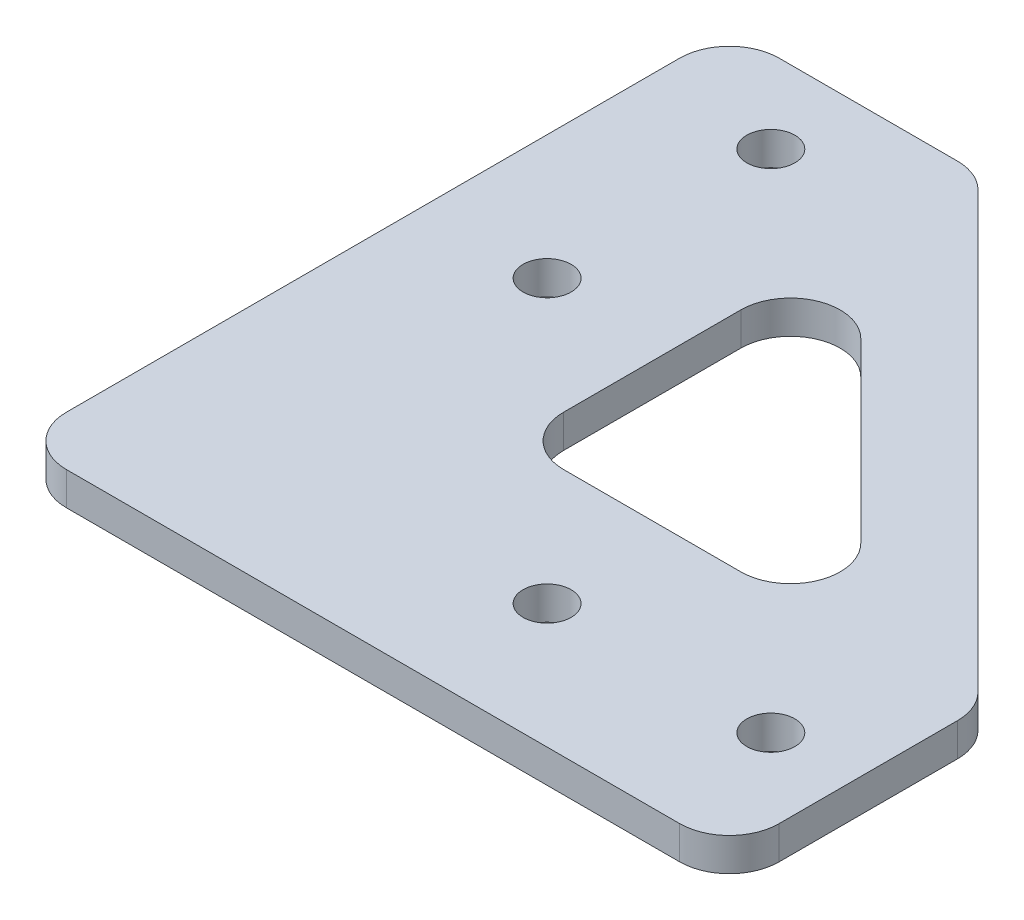
ISO-10303-21;
HEADER;
FILE_DESCRIPTION(('STEP AP214'),'2;1');
FILE_NAME('part.step','',(''),(''),'','','');
FILE_SCHEMA(('AUTOMOTIVE_DESIGN { 1 0 10303 214 1 1 1 1 }'));
ENDSEC;
DATA;
#1=APPLICATION_CONTEXT('core data for automotive mechanical design processes');
#2=APPLICATION_PROTOCOL_DEFINITION('international standard','automotive_design',2000,#1);
#3=PRODUCT_CONTEXT('',#1,'mechanical');
#4=PRODUCT('Part','Part','',(#3));
#5=PRODUCT_RELATED_PRODUCT_CATEGORY('part','',(#4));
#6=PRODUCT_DEFINITION_FORMATION('','',#4);
#7=PRODUCT_DEFINITION_CONTEXT('part definition',#1,'design');
#8=PRODUCT_DEFINITION('design','',#6,#7);
#9=PRODUCT_DEFINITION_SHAPE('','',#8);
#10=(LENGTH_UNIT() NAMED_UNIT(*) SI_UNIT(.MILLI.,.METRE.));
#11=(NAMED_UNIT(*) PLANE_ANGLE_UNIT() SI_UNIT($,.RADIAN.));
#12=(NAMED_UNIT(*) SI_UNIT($,.STERADIAN.) SOLID_ANGLE_UNIT());
#13=UNCERTAINTY_MEASURE_WITH_UNIT(LENGTH_MEASURE(1.E-05),#10,'distance_accuracy_value','');
#14=(GEOMETRIC_REPRESENTATION_CONTEXT(3) GLOBAL_UNCERTAINTY_ASSIGNED_CONTEXT((#13)) GLOBAL_UNIT_ASSIGNED_CONTEXT((#10,
#11,#12)) REPRESENTATION_CONTEXT('',''));
#15=CARTESIAN_POINT('',(0.,0.,0.));
#16=DIRECTION('',(0.,0.,1.));
#17=DIRECTION('',(1.,0.,0.));
#18=AXIS2_PLACEMENT_3D('',#15,#16,#17);
#19=CARTESIAN_POINT('',(0.,2.,0.));
#20=DIRECTION('',(0.,1.,0.));
#21=DIRECTION('',(0.,0.,1.));
#22=AXIS2_PLACEMENT_3D('',#19,#20,#21);
#23=PLANE('',#22);
#24=CARTESIAN_POINT('',(38.,2.,7.50000000000001));
#25=DIRECTION('',(0.,1.,0.));
#26=DIRECTION('',(0.,0.,1.));
#27=AXIS2_PLACEMENT_3D('',#24,#25,#26);
#28=CIRCLE('',#27,1.45);
#29=CARTESIAN_POINT('',(38.,2.,8.95000000000001));
#30=VERTEX_POINT('',#29);
#31=EDGE_CURVE('E386',#30,#30,#28,.T.);
#32=ORIENTED_EDGE('',*,*,#31,.F.);
#33=EDGE_LOOP('',(#32));
#34=FACE_BOUND('',#33,.T.);
#35=CARTESIAN_POINT('',(24.5,2.,7.50000000000001));
#36=DIRECTION('',(0.,1.,0.));
#37=DIRECTION('',(0.,0.,1.));
#38=AXIS2_PLACEMENT_3D('',#35,#36,#37);
#39=CIRCLE('',#38,1.45);
#40=CARTESIAN_POINT('',(24.5,2.,8.95));
#41=VERTEX_POINT('',#40);
#42=EDGE_CURVE('E269',#41,#41,#39,.T.);
#43=ORIENTED_EDGE('',*,*,#42,.F.);
#44=EDGE_LOOP('',(#43));
#45=FACE_BOUND('',#44,.T.);
#46=DIRECTION('',(-1.,0.,0.));
#47=VECTOR('',#46,1.);
#48=CARTESIAN_POINT('',(0.,2.,-28.));
#49=LINE('',#48,#47);
#50=CARTESIAN_POINT('',(13.7573593128807,2.,-28.));
#51=VERTEX_POINT('',#50);
#52=CARTESIAN_POINT('',(3.,2.,-28.));
#53=VERTEX_POINT('',#52);
#54=EDGE_CURVE('E178',#51,#53,#49,.T.);
#55=ORIENTED_EDGE('',*,*,#54,.T.);
#56=CARTESIAN_POINT('',(3.,2.,-25.));
#57=DIRECTION('',(0.,1.,0.));
#58=DIRECTION('',(0.,0.,1.));
#59=AXIS2_PLACEMENT_3D('',#56,#57,#58);
#60=CIRCLE('',#59,3.);
#61=CARTESIAN_POINT('',(0.,2.,-25.));
#62=VERTEX_POINT('',#61);
#63=EDGE_CURVE('E224',#53,#62,#60,.T.);
#64=ORIENTED_EDGE('',*,*,#63,.T.);
#65=DIRECTION('',(0.,0.,1.));
#66=VECTOR('',#65,1.);
#67=CARTESIAN_POINT('',(0.,2.,0.));
#68=LINE('',#67,#66);
#69=CARTESIAN_POINT('',(0.,2.,12.));
#70=VERTEX_POINT('',#69);
#71=EDGE_CURVE('E277',#62,#70,#68,.T.);
#72=ORIENTED_EDGE('',*,*,#71,.T.);
#73=CARTESIAN_POINT('',(3.,2.,12.));
#74=DIRECTION('',(0.,1.,0.));
#75=DIRECTION('',(0.,0.,1.));
#76=AXIS2_PLACEMENT_3D('',#73,#74,#75);
#77=CIRCLE('',#76,3.);
#78=CARTESIAN_POINT('',(3.,2.,15.));
#79=VERTEX_POINT('',#78);
#80=EDGE_CURVE('E217',#70,#79,#77,.T.);
#81=ORIENTED_EDGE('',*,*,#80,.T.);
#82=DIRECTION('',(1.,0.,0.));
#83=VECTOR('',#82,1.);
#84=CARTESIAN_POINT('',(0.,2.,15.));
#85=LINE('',#84,#83);
#86=CARTESIAN_POINT('',(40.,2.,15.));
#87=VERTEX_POINT('',#86);
#88=EDGE_CURVE('E280',#79,#87,#85,.T.);
#89=ORIENTED_EDGE('',*,*,#88,.T.);
#90=CARTESIAN_POINT('',(40.,2.,12.));
#91=DIRECTION('',(0.,1.,0.));
#92=DIRECTION('',(0.,0.,1.));
#93=AXIS2_PLACEMENT_3D('',#90,#91,#92);
#94=CIRCLE('',#93,3.);
#95=CARTESIAN_POINT('',(43.,2.,12.));
#96=VERTEX_POINT('',#95);
#97=EDGE_CURVE('E219',#87,#96,#94,.T.);
#98=ORIENTED_EDGE('',*,*,#97,.T.);
#99=DIRECTION('',(0.,0.,-1.));
#100=VECTOR('',#99,1.);
#101=CARTESIAN_POINT('',(43.,2.,0.));
#102=LINE('',#101,#100);
#103=CARTESIAN_POINT('',(43.,2.,1.24264068711928));
#104=VERTEX_POINT('',#103);
#105=EDGE_CURVE('E283',#96,#104,#102,.T.);
#106=ORIENTED_EDGE('',*,*,#105,.T.);
#107=CARTESIAN_POINT('',(40.,2.,1.24264068711928));
#108=DIRECTION('',(0.,1.,0.));
#109=DIRECTION('',(0.,0.,1.));
#110=AXIS2_PLACEMENT_3D('',#107,#108,#109);
#111=CIRCLE('',#110,3.);
#112=CARTESIAN_POINT('',(42.1213203435596,2.,-0.878679656440361));
#113=VERTEX_POINT('',#112);
#114=EDGE_CURVE('E63',#104,#113,#111,.T.);
#115=ORIENTED_EDGE('',*,*,#114,.T.);
#116=DIRECTION('',(-0.707106781186547,0.,-0.707106781186548));
#117=VECTOR('',#116,1.);
#118=CARTESIAN_POINT('',(15.,2.,-28.));
#119=LINE('',#118,#117);
#120=CARTESIAN_POINT('',(15.8786796564404,2.,-27.1213203435596));
#121=VERTEX_POINT('',#120);
#122=EDGE_CURVE('E183',#113,#121,#119,.T.);
#123=ORIENTED_EDGE('',*,*,#122,.T.);
#124=CARTESIAN_POINT('',(13.7573593128807,2.,-25.));
#125=DIRECTION('',(0.,1.,0.));
#126=DIRECTION('',(0.,0.,1.));
#127=AXIS2_PLACEMENT_3D('',#124,#125,#126);
#128=CIRCLE('',#127,3.);
#129=EDGE_CURVE('E222',#121,#51,#128,.T.);
#130=ORIENTED_EDGE('',*,*,#129,.T.);
#131=EDGE_LOOP('',(#55,#64,#72,#81,#89,#98,#106,#115,#123,#130));
#132=FACE_BOUND('',#131,.T.);
#133=DIRECTION('',(1.,0.,0.));
#134=VECTOR('',#133,1.);
#135=CARTESIAN_POINT('',(35.9289321881345,2.,0.));
#136=LINE('',#135,#134);
#137=CARTESIAN_POINT('',(18.,2.,0.));
#138=VERTEX_POINT('',#137);
#139=CARTESIAN_POINT('',(28.6862915010152,2.,0.));
#140=VERTEX_POINT('',#139);
#141=EDGE_CURVE('E264',#138,#140,#136,.T.);
#142=ORIENTED_EDGE('',*,*,#141,.F.);
#143=CARTESIAN_POINT('',(18.,2.,-3.));
#144=DIRECTION('',(0.,1.,0.));
#145=DIRECTION('',(0.,0.,1.));
#146=AXIS2_PLACEMENT_3D('',#143,#144,#145);
#147=CIRCLE('',#146,3.);
#148=CARTESIAN_POINT('',(15.,2.,-3.));
#149=VERTEX_POINT('',#148);
#150=EDGE_CURVE('E11',#138,#149,#147,.F.);
#151=ORIENTED_EDGE('',*,*,#150,.T.);
#152=DIRECTION('',(0.,0.,1.));
#153=VECTOR('',#152,1.);
#154=CARTESIAN_POINT('',(15.,2.,0.));
#155=LINE('',#154,#153);
#156=CARTESIAN_POINT('',(15.,2.,-13.6862915010152));
#157=VERTEX_POINT('',#156);
#158=EDGE_CURVE('E255',#157,#149,#155,.T.);
#159=ORIENTED_EDGE('',*,*,#158,.F.);
#160=CARTESIAN_POINT('',(18.,2.,-13.6862915010152));
#161=DIRECTION('',(0.,1.,0.));
#162=DIRECTION('',(0.,0.,1.));
#163=AXIS2_PLACEMENT_3D('',#160,#161,#162);
#164=CIRCLE('',#163,3.);
#165=CARTESIAN_POINT('',(20.1213203435596,2.,-15.8076118445749));
#166=VERTEX_POINT('',#165);
#167=EDGE_CURVE('E166',#157,#166,#164,.F.);
#168=ORIENTED_EDGE('',*,*,#167,.T.);
#169=DIRECTION('',(-0.707106781186547,0.,-0.707106781186548));
#170=VECTOR('',#169,1.);
#171=CARTESIAN_POINT('',(15.,2.,-20.9289321881345));
#172=LINE('',#171,#170);
#173=CARTESIAN_POINT('',(30.8076118445749,2.,-5.12132034355964));
#174=VERTEX_POINT('',#173);
#175=EDGE_CURVE('E252',#174,#166,#172,.T.);
#176=ORIENTED_EDGE('',*,*,#175,.F.);
#177=CARTESIAN_POINT('',(28.6862915010152,2.,-3.));
#178=DIRECTION('',(0.,1.,0.));
#179=DIRECTION('',(0.,0.,1.));
#180=AXIS2_PLACEMENT_3D('',#177,#178,#179);
#181=CIRCLE('',#180,3.);
#182=EDGE_CURVE('E242',#174,#140,#181,.F.);
#183=ORIENTED_EDGE('',*,*,#182,.T.);
#184=EDGE_LOOP('',(#142,#151,#159,#168,#176,#183));
#185=FACE_BOUND('',#184,.T.);
#186=CARTESIAN_POINT('',(7.5,2.,-9.5));
#187=DIRECTION('',(0.,1.,0.));
#188=DIRECTION('',(0.,0.,1.));
#189=AXIS2_PLACEMENT_3D('',#186,#187,#188);
#190=CIRCLE('',#189,1.45);
#191=CARTESIAN_POINT('',(7.5,2.,-8.05));
#192=VERTEX_POINT('',#191);
#193=EDGE_CURVE('E381',#192,#192,#190,.T.);
#194=ORIENTED_EDGE('',*,*,#193,.F.);
#195=EDGE_LOOP('',(#194));
#196=FACE_BOUND('',#195,.T.);
#197=CARTESIAN_POINT('',(7.5,2.,-23.));
#198=DIRECTION('',(0.,1.,0.));
#199=DIRECTION('',(0.,0.,1.));
#200=AXIS2_PLACEMENT_3D('',#197,#198,#199);
#201=CIRCLE('',#200,1.45);
#202=CARTESIAN_POINT('',(7.5,2.,-21.55));
#203=VERTEX_POINT('',#202);
#204=EDGE_CURVE('E392',#203,#203,#201,.T.);
#205=ORIENTED_EDGE('',*,*,#204,.F.);
#206=EDGE_LOOP('',(#205));
#207=FACE_BOUND('',#206,.T.);
#208=ADVANCED_FACE('F41',(#34,#45,#132,#185,#196,#207),#23,.T.);
#209=CARTESIAN_POINT('',(0.,0.,0.));
#210=DIRECTION('',(0.,1.,0.));
#211=DIRECTION('',(0.,0.,1.));
#212=AXIS2_PLACEMENT_3D('',#209,#210,#211);
#213=PLANE('',#212);
#214=DIRECTION('',(0.,0.,1.));
#215=VECTOR('',#214,1.);
#216=CARTESIAN_POINT('',(0.,0.,0.));
#217=LINE('',#216,#215);
#218=CARTESIAN_POINT('',(0.,0.,-25.));
#219=VERTEX_POINT('',#218);
#220=CARTESIAN_POINT('',(0.,0.,12.));
#221=VERTEX_POINT('',#220);
#222=EDGE_CURVE('E186',#219,#221,#217,.T.);
#223=ORIENTED_EDGE('',*,*,#222,.F.);
#224=CARTESIAN_POINT('',(3.,0.,-25.));
#225=DIRECTION('',(0.,1.,0.));
#226=DIRECTION('',(0.,0.,1.));
#227=AXIS2_PLACEMENT_3D('',#224,#225,#226);
#228=CIRCLE('',#227,3.);
#229=CARTESIAN_POINT('',(3.,0.,-28.));
#230=VERTEX_POINT('',#229);
#231=EDGE_CURVE('E210',#219,#230,#228,.F.);
#232=ORIENTED_EDGE('',*,*,#231,.T.);
#233=DIRECTION('',(-1.,0.,0.));
#234=VECTOR('',#233,1.);
#235=CARTESIAN_POINT('',(0.,0.,-28.));
#236=LINE('',#235,#234);
#237=CARTESIAN_POINT('',(13.7573593128807,0.,-28.));
#238=VERTEX_POINT('',#237);
#239=EDGE_CURVE('E292',#238,#230,#236,.T.);
#240=ORIENTED_EDGE('',*,*,#239,.F.);
#241=CARTESIAN_POINT('',(13.7573593128807,0.,-25.));
#242=DIRECTION('',(0.,1.,0.));
#243=DIRECTION('',(0.,0.,1.));
#244=AXIS2_PLACEMENT_3D('',#241,#242,#243);
#245=CIRCLE('',#244,3.);
#246=CARTESIAN_POINT('',(15.8786796564404,0.,-27.1213203435596));
#247=VERTEX_POINT('',#246);
#248=EDGE_CURVE('E208',#238,#247,#245,.F.);
#249=ORIENTED_EDGE('',*,*,#248,.T.);
#250=DIRECTION('',(-0.707106781186547,0.,-0.707106781186548));
#251=VECTOR('',#250,1.);
#252=CARTESIAN_POINT('',(15.,0.,-28.));
#253=LINE('',#252,#251);
#254=CARTESIAN_POINT('',(42.1213203435596,0.,-0.878679656440361));
#255=VERTEX_POINT('',#254);
#256=EDGE_CURVE('E291',#255,#247,#253,.T.);
#257=ORIENTED_EDGE('',*,*,#256,.F.);
#258=CARTESIAN_POINT('',(40.,0.,1.24264068711928));
#259=DIRECTION('',(0.,1.,0.));
#260=DIRECTION('',(0.,0.,1.));
#261=AXIS2_PLACEMENT_3D('',#258,#259,#260);
#262=CIRCLE('',#261,3.);
#263=CARTESIAN_POINT('',(43.,0.,1.24264068711928));
#264=VERTEX_POINT('',#263);
#265=EDGE_CURVE('E206',#255,#264,#262,.F.);
#266=ORIENTED_EDGE('',*,*,#265,.T.);
#267=DIRECTION('',(0.,0.,-1.));
#268=VECTOR('',#267,1.);
#269=CARTESIAN_POINT('',(43.,0.,0.));
#270=LINE('',#269,#268);
#271=CARTESIAN_POINT('',(43.,0.,12.));
#272=VERTEX_POINT('',#271);
#273=EDGE_CURVE('E288',#272,#264,#270,.T.);
#274=ORIENTED_EDGE('',*,*,#273,.F.);
#275=CARTESIAN_POINT('',(40.,0.,12.));
#276=DIRECTION('',(0.,1.,0.));
#277=DIRECTION('',(0.,0.,1.));
#278=AXIS2_PLACEMENT_3D('',#275,#276,#277);
#279=CIRCLE('',#278,3.);
#280=CARTESIAN_POINT('',(40.,0.,15.));
#281=VERTEX_POINT('',#280);
#282=EDGE_CURVE('E204',#272,#281,#279,.F.);
#283=ORIENTED_EDGE('',*,*,#282,.T.);
#284=DIRECTION('',(1.,0.,0.));
#285=VECTOR('',#284,1.);
#286=CARTESIAN_POINT('',(0.,0.,15.));
#287=LINE('',#286,#285);
#288=CARTESIAN_POINT('',(3.,0.,15.));
#289=VERTEX_POINT('',#288);
#290=EDGE_CURVE('E263',#289,#281,#287,.T.);
#291=ORIENTED_EDGE('',*,*,#290,.F.);
#292=CARTESIAN_POINT('',(3.,0.,12.));
#293=DIRECTION('',(0.,1.,0.));
#294=DIRECTION('',(0.,0.,1.));
#295=AXIS2_PLACEMENT_3D('',#292,#293,#294);
#296=CIRCLE('',#295,3.);
#297=EDGE_CURVE('E202',#289,#221,#296,.F.);
#298=ORIENTED_EDGE('',*,*,#297,.T.);
#299=EDGE_LOOP('',(#223,#232,#240,#249,#257,#266,#274,#283,#291,#298));
#300=FACE_BOUND('',#299,.T.);
#301=DIRECTION('',(-0.707106781186547,0.,-0.707106781186548));
#302=VECTOR('',#301,1.);
#303=CARTESIAN_POINT('',(15.,0.,-20.9289321881345));
#304=LINE('',#303,#302);
#305=CARTESIAN_POINT('',(30.8076118445749,0.,-5.12132034355964));
#306=VERTEX_POINT('',#305);
#307=CARTESIAN_POINT('',(20.1213203435596,0.,-15.8076118445749));
#308=VERTEX_POINT('',#307);
#309=EDGE_CURVE('E175',#306,#308,#304,.T.);
#310=ORIENTED_EDGE('',*,*,#309,.T.);
#311=CARTESIAN_POINT('',(18.,0.,-13.6862915010152));
#312=DIRECTION('',(0.,1.,0.));
#313=DIRECTION('',(0.,0.,1.));
#314=AXIS2_PLACEMENT_3D('',#311,#312,#313);
#315=CIRCLE('',#314,3.);
#316=CARTESIAN_POINT('',(15.,0.,-13.6862915010152));
#317=VERTEX_POINT('',#316);
#318=EDGE_CURVE('E244',#308,#317,#315,.T.);
#319=ORIENTED_EDGE('',*,*,#318,.T.);
#320=DIRECTION('',(0.,0.,1.));
#321=VECTOR('',#320,1.);
#322=CARTESIAN_POINT('',(15.,0.,0.));
#323=LINE('',#322,#321);
#324=CARTESIAN_POINT('',(15.,0.,-3.));
#325=VERTEX_POINT('',#324);
#326=EDGE_CURVE('E161',#317,#325,#323,.T.);
#327=ORIENTED_EDGE('',*,*,#326,.T.);
#328=CARTESIAN_POINT('',(18.,0.,-3.));
#329=DIRECTION('',(0.,1.,0.));
#330=DIRECTION('',(0.,0.,1.));
#331=AXIS2_PLACEMENT_3D('',#328,#329,#330);
#332=CIRCLE('',#331,3.);
#333=CARTESIAN_POINT('',(18.,0.,0.));
#334=VERTEX_POINT('',#333);
#335=EDGE_CURVE('E49',#325,#334,#332,.T.);
#336=ORIENTED_EDGE('',*,*,#335,.T.);
#337=DIRECTION('',(1.,0.,0.));
#338=VECTOR('',#337,1.);
#339=CARTESIAN_POINT('',(35.9289321881345,0.,0.));
#340=LINE('',#339,#338);
#341=CARTESIAN_POINT('',(28.6862915010152,0.,0.));
#342=VERTEX_POINT('',#341);
#343=EDGE_CURVE('E159',#334,#342,#340,.T.);
#344=ORIENTED_EDGE('',*,*,#343,.T.);
#345=CARTESIAN_POINT('',(28.6862915010152,0.,-3.));
#346=DIRECTION('',(0.,1.,0.));
#347=DIRECTION('',(0.,0.,1.));
#348=AXIS2_PLACEMENT_3D('',#345,#346,#347);
#349=CIRCLE('',#348,3.);
#350=EDGE_CURVE('E240',#342,#306,#349,.T.);
#351=ORIENTED_EDGE('',*,*,#350,.T.);
#352=EDGE_LOOP('',(#310,#319,#327,#336,#344,#351));
#353=FACE_BOUND('',#352,.T.);
#354=CARTESIAN_POINT('',(24.5,0.,7.50000000000001));
#355=DIRECTION('',(0.,1.,0.));
#356=DIRECTION('',(0.,0.,1.));
#357=AXIS2_PLACEMENT_3D('',#354,#355,#356);
#358=CIRCLE('',#357,1.45);
#359=CARTESIAN_POINT('',(24.5,0.,8.95));
#360=VERTEX_POINT('',#359);
#361=EDGE_CURVE('E272',#360,#360,#358,.T.);
#362=ORIENTED_EDGE('',*,*,#361,.T.);
#363=EDGE_LOOP('',(#362));
#364=FACE_BOUND('',#363,.T.);
#365=CARTESIAN_POINT('',(7.5,0.,-9.5));
#366=DIRECTION('',(0.,1.,0.));
#367=DIRECTION('',(0.,0.,1.));
#368=AXIS2_PLACEMENT_3D('',#365,#366,#367);
#369=CIRCLE('',#368,1.45);
#370=CARTESIAN_POINT('',(7.5,0.,-8.05));
#371=VERTEX_POINT('',#370);
#372=EDGE_CURVE('E383',#371,#371,#369,.T.);
#373=ORIENTED_EDGE('',*,*,#372,.T.);
#374=EDGE_LOOP('',(#373));
#375=FACE_BOUND('',#374,.T.);
#376=CARTESIAN_POINT('',(38.,0.,7.50000000000001));
#377=DIRECTION('',(0.,1.,0.));
#378=DIRECTION('',(0.,0.,1.));
#379=AXIS2_PLACEMENT_3D('',#376,#377,#378);
#380=CIRCLE('',#379,1.45);
#381=CARTESIAN_POINT('',(38.,0.,8.95000000000001));
#382=VERTEX_POINT('',#381);
#383=EDGE_CURVE('E389',#382,#382,#380,.T.);
#384=ORIENTED_EDGE('',*,*,#383,.T.);
#385=EDGE_LOOP('',(#384));
#386=FACE_BOUND('',#385,.T.);
#387=CARTESIAN_POINT('',(7.5,0.,-23.));
#388=DIRECTION('',(0.,1.,0.));
#389=DIRECTION('',(0.,0.,1.));
#390=AXIS2_PLACEMENT_3D('',#387,#388,#389);
#391=CIRCLE('',#390,1.45);
#392=CARTESIAN_POINT('',(7.5,0.,-21.55));
#393=VERTEX_POINT('',#392);
#394=EDGE_CURVE('E395',#393,#393,#391,.T.);
#395=ORIENTED_EDGE('',*,*,#394,.T.);
#396=EDGE_LOOP('',(#395));
#397=FACE_BOUND('',#396,.T.);
#398=ADVANCED_FACE('F157',(#300,#353,#364,#375,#386,#397),#213,.F.);
#399=CARTESIAN_POINT('',(0.,2.,15.));
#400=DIRECTION('',(0.,0.,-1.));
#401=DIRECTION('',(-1.,0.,0.));
#402=AXIS2_PLACEMENT_3D('',#399,#400,#401);
#403=PLANE('',#402);
#404=ORIENTED_EDGE('',*,*,#290,.T.);
#405=DIRECTION('',(0.,-1.,0.));
#406=VECTOR('',#405,1.);
#407=CARTESIAN_POINT('',(40.,2.,15.));
#408=LINE('',#407,#406);
#409=EDGE_CURVE('E238',#281,#87,#408,.F.);
#410=ORIENTED_EDGE('',*,*,#409,.T.);
#411=ORIENTED_EDGE('',*,*,#88,.F.);
#412=DIRECTION('',(0.,-1.,0.));
#413=VECTOR('',#412,1.);
#414=CARTESIAN_POINT('',(3.,2.,15.));
#415=LINE('',#414,#413);
#416=EDGE_CURVE('E235',#79,#289,#415,.T.);
#417=ORIENTED_EDGE('',*,*,#416,.T.);
#418=EDGE_LOOP('',(#404,#410,#411,#417));
#419=FACE_BOUND('',#418,.T.);
#420=ADVANCED_FACE('F312',(#419),#403,.F.);
#421=CARTESIAN_POINT('',(43.,2.,0.));
#422=DIRECTION('',(-1.,0.,0.));
#423=DIRECTION('',(0.,0.,1.));
#424=AXIS2_PLACEMENT_3D('',#421,#422,#423);
#425=PLANE('',#424);
#426=ORIENTED_EDGE('',*,*,#273,.T.);
#427=DIRECTION('',(0.,-1.,0.));
#428=VECTOR('',#427,1.);
#429=CARTESIAN_POINT('',(43.,2.,1.24264068711928));
#430=LINE('',#429,#428);
#431=EDGE_CURVE('E233',#264,#104,#430,.F.);
#432=ORIENTED_EDGE('',*,*,#431,.T.);
#433=ORIENTED_EDGE('',*,*,#105,.F.);
#434=DIRECTION('',(0.,-1.,0.));
#435=VECTOR('',#434,1.);
#436=CARTESIAN_POINT('',(43.,2.,12.));
#437=LINE('',#436,#435);
#438=EDGE_CURVE('E230',#96,#272,#437,.T.);
#439=ORIENTED_EDGE('',*,*,#438,.T.);
#440=EDGE_LOOP('',(#426,#432,#433,#439));
#441=FACE_BOUND('',#440,.T.);
#442=ADVANCED_FACE('F320',(#441),#425,.F.);
#443=CARTESIAN_POINT('',(15.,2.,-28.));
#444=DIRECTION('',(-0.707106781186548,0.,0.707106781186547));
#445=DIRECTION('',(0.707106781186547,0.,0.707106781186548));
#446=AXIS2_PLACEMENT_3D('',#443,#444,#445);
#447=PLANE('',#446);
#448=ORIENTED_EDGE('',*,*,#256,.T.);
#449=DIRECTION('',(0.,-1.,0.));
#450=VECTOR('',#449,1.);
#451=CARTESIAN_POINT('',(15.8786796564404,2.,-27.1213203435596));
#452=LINE('',#451,#450);
#453=EDGE_CURVE('E56',#247,#121,#452,.F.);
#454=ORIENTED_EDGE('',*,*,#453,.T.);
#455=ORIENTED_EDGE('',*,*,#122,.F.);
#456=DIRECTION('',(0.,-1.,0.));
#457=VECTOR('',#456,1.);
#458=CARTESIAN_POINT('',(42.1213203435596,2.,-0.878679656440361));
#459=LINE('',#458,#457);
#460=EDGE_CURVE('E226',#113,#255,#459,.T.);
#461=ORIENTED_EDGE('',*,*,#460,.T.);
#462=EDGE_LOOP('',(#448,#454,#455,#461));
#463=FACE_BOUND('',#462,.T.);
#464=ADVANCED_FACE('F327',(#463),#447,.F.);
#465=CARTESIAN_POINT('',(0.,2.,-28.));
#466=DIRECTION('',(0.,0.,1.));
#467=DIRECTION('',(1.,0.,0.));
#468=AXIS2_PLACEMENT_3D('',#465,#466,#467);
#469=PLANE('',#468);
#470=ORIENTED_EDGE('',*,*,#239,.T.);
#471=DIRECTION('',(0.,-1.,0.));
#472=VECTOR('',#471,1.);
#473=CARTESIAN_POINT('',(3.,2.,-28.));
#474=LINE('',#473,#472);
#475=EDGE_CURVE('E215',#230,#53,#474,.F.);
#476=ORIENTED_EDGE('',*,*,#475,.T.);
#477=ORIENTED_EDGE('',*,*,#54,.F.);
#478=DIRECTION('',(0.,-1.,0.));
#479=VECTOR('',#478,1.);
#480=CARTESIAN_POINT('',(13.7573593128807,2.,-28.));
#481=LINE('',#480,#479);
#482=EDGE_CURVE('E212',#51,#238,#481,.T.);
#483=ORIENTED_EDGE('',*,*,#482,.T.);
#484=EDGE_LOOP('',(#470,#476,#477,#483));
#485=FACE_BOUND('',#484,.T.);
#486=ADVANCED_FACE('F333',(#485),#469,.F.);
#487=CARTESIAN_POINT('',(0.,2.,0.));
#488=DIRECTION('',(1.,0.,0.));
#489=DIRECTION('',(0.,0.,-1.));
#490=AXIS2_PLACEMENT_3D('',#487,#488,#489);
#491=PLANE('',#490);
#492=ORIENTED_EDGE('',*,*,#71,.F.);
#493=DIRECTION('',(0.,-1.,0.));
#494=VECTOR('',#493,1.);
#495=CARTESIAN_POINT('',(0.,2.,-25.));
#496=LINE('',#495,#494);
#497=EDGE_CURVE('E199',#62,#219,#496,.T.);
#498=ORIENTED_EDGE('',*,*,#497,.T.);
#499=ORIENTED_EDGE('',*,*,#222,.T.);
#500=DIRECTION('',(0.,-1.,0.));
#501=VECTOR('',#500,1.);
#502=CARTESIAN_POINT('',(0.,2.,12.));
#503=LINE('',#502,#501);
#504=EDGE_CURVE('E197',#221,#70,#503,.F.);
#505=ORIENTED_EDGE('',*,*,#504,.T.);
#506=EDGE_LOOP('',(#492,#498,#499,#505));
#507=FACE_BOUND('',#506,.T.);
#508=ADVANCED_FACE('F302',(#507),#491,.F.);
#509=CARTESIAN_POINT('',(15.,2.,0.));
#510=DIRECTION('',(1.,0.,0.));
#511=DIRECTION('',(0.,0.,-1.));
#512=AXIS2_PLACEMENT_3D('',#509,#510,#511);
#513=PLANE('',#512);
#514=ORIENTED_EDGE('',*,*,#326,.F.);
#515=DIRECTION('',(0.,-1.,0.));
#516=VECTOR('',#515,1.);
#517=CARTESIAN_POINT('',(15.,2.,-13.6862915010152));
#518=LINE('',#517,#516);
#519=EDGE_CURVE('E195',#317,#157,#518,.F.);
#520=ORIENTED_EDGE('',*,*,#519,.T.);
#521=ORIENTED_EDGE('',*,*,#158,.T.);
#522=DIRECTION('',(0.,-1.,0.));
#523=VECTOR('',#522,1.);
#524=CARTESIAN_POINT('',(15.,0.,-3.));
#525=LINE('',#524,#523);
#526=EDGE_CURVE('E193',#149,#325,#525,.T.);
#527=ORIENTED_EDGE('',*,*,#526,.T.);
#528=EDGE_LOOP('',(#514,#520,#521,#527));
#529=FACE_BOUND('',#528,.T.);
#530=ADVANCED_FACE('F268',(#529),#513,.T.);
#531=CARTESIAN_POINT('',(35.9289321881345,2.,0.));
#532=DIRECTION('',(0.,0.,-1.));
#533=DIRECTION('',(-1.,0.,0.));
#534=AXIS2_PLACEMENT_3D('',#531,#532,#533);
#535=PLANE('',#534);
#536=ORIENTED_EDGE('',*,*,#141,.T.);
#537=DIRECTION('',(0.,-1.,0.));
#538=VECTOR('',#537,1.);
#539=CARTESIAN_POINT('',(28.6862915010152,0.,0.));
#540=LINE('',#539,#538);
#541=EDGE_CURVE('E174',#140,#342,#540,.T.);
#542=ORIENTED_EDGE('',*,*,#541,.T.);
#543=ORIENTED_EDGE('',*,*,#343,.F.);
#544=DIRECTION('',(0.,-1.,0.));
#545=VECTOR('',#544,1.);
#546=CARTESIAN_POINT('',(18.,2.,0.));
#547=LINE('',#546,#545);
#548=EDGE_CURVE('E171',#334,#138,#547,.F.);
#549=ORIENTED_EDGE('',*,*,#548,.T.);
#550=EDGE_LOOP('',(#536,#542,#543,#549));
#551=FACE_BOUND('',#550,.T.);
#552=ADVANCED_FACE('F170',(#551),#535,.T.);
#553=CARTESIAN_POINT('',(15.,2.,-20.9289321881345));
#554=DIRECTION('',(-0.707106781186548,0.,0.707106781186547));
#555=DIRECTION('',(0.707106781186547,0.,0.707106781186548));
#556=AXIS2_PLACEMENT_3D('',#553,#554,#555);
#557=PLANE('',#556);
#558=ORIENTED_EDGE('',*,*,#309,.F.);
#559=DIRECTION('',(0.,-1.,0.));
#560=VECTOR('',#559,1.);
#561=CARTESIAN_POINT('',(30.8076118445749,2.,-5.12132034355964));
#562=LINE('',#561,#560);
#563=EDGE_CURVE('E191',#306,#174,#562,.F.);
#564=ORIENTED_EDGE('',*,*,#563,.T.);
#565=ORIENTED_EDGE('',*,*,#175,.T.);
#566=DIRECTION('',(0.,-1.,0.));
#567=VECTOR('',#566,1.);
#568=CARTESIAN_POINT('',(20.1213203435596,0.,-15.8076118445749));
#569=LINE('',#568,#567);
#570=EDGE_CURVE('E180',#166,#308,#569,.T.);
#571=ORIENTED_EDGE('',*,*,#570,.T.);
#572=EDGE_LOOP('',(#558,#564,#565,#571));
#573=FACE_BOUND('',#572,.T.);
#574=ADVANCED_FACE('F261',(#573),#557,.T.);
#575=CARTESIAN_POINT('',(24.5,2.,7.50000000000001));
#576=DIRECTION('',(0.,-1.,0.));
#577=DIRECTION('',(0.,0.,-1.));
#578=AXIS2_PLACEMENT_3D('',#575,#576,#577);
#579=CYLINDRICAL_SURFACE('',#578,1.45);
#580=ORIENTED_EDGE('',*,*,#42,.T.);
#581=EDGE_LOOP('',(#580));
#582=FACE_BOUND('',#581,.T.);
#583=ORIENTED_EDGE('',*,*,#361,.F.);
#584=EDGE_LOOP('',(#583));
#585=FACE_BOUND('',#584,.T.);
#586=ADVANCED_FACE('F414',(#582,#585),#579,.F.);
#587=CARTESIAN_POINT('',(7.5,2.,-9.5));
#588=DIRECTION('',(0.,-1.,0.));
#589=DIRECTION('',(0.,0.,-1.));
#590=AXIS2_PLACEMENT_3D('',#587,#588,#589);
#591=CYLINDRICAL_SURFACE('',#590,1.45);
#592=ORIENTED_EDGE('',*,*,#193,.T.);
#593=EDGE_LOOP('',(#592));
#594=FACE_BOUND('',#593,.T.);
#595=ORIENTED_EDGE('',*,*,#372,.F.);
#596=EDGE_LOOP('',(#595));
#597=FACE_BOUND('',#596,.T.);
#598=ADVANCED_FACE('F407',(#594,#597),#591,.F.);
#599=CARTESIAN_POINT('',(38.,2.,7.50000000000001));
#600=DIRECTION('',(0.,-1.,0.));
#601=DIRECTION('',(0.,0.,-1.));
#602=AXIS2_PLACEMENT_3D('',#599,#600,#601);
#603=CYLINDRICAL_SURFACE('',#602,1.45);
#604=ORIENTED_EDGE('',*,*,#31,.T.);
#605=EDGE_LOOP('',(#604));
#606=FACE_BOUND('',#605,.T.);
#607=ORIENTED_EDGE('',*,*,#383,.F.);
#608=EDGE_LOOP('',(#607));
#609=FACE_BOUND('',#608,.T.);
#610=ADVANCED_FACE('F375',(#606,#609),#603,.F.);
#611=CARTESIAN_POINT('',(7.5,2.,-23.));
#612=DIRECTION('',(0.,-1.,0.));
#613=DIRECTION('',(0.,0.,-1.));
#614=AXIS2_PLACEMENT_3D('',#611,#612,#613);
#615=CYLINDRICAL_SURFACE('',#614,1.45);
#616=ORIENTED_EDGE('',*,*,#204,.T.);
#617=EDGE_LOOP('',(#616));
#618=FACE_BOUND('',#617,.T.);
#619=ORIENTED_EDGE('',*,*,#394,.F.);
#620=EDGE_LOOP('',(#619));
#621=FACE_BOUND('',#620,.T.);
#622=ADVANCED_FACE('F370',(#618,#621),#615,.F.);
#623=CARTESIAN_POINT('',(28.6862915010152,2.,-3.));
#624=DIRECTION('',(0.,1.,0.));
#625=DIRECTION('',(0.,0.,1.));
#626=AXIS2_PLACEMENT_3D('',#623,#624,#625);
#627=CYLINDRICAL_SURFACE('',#626,3.);
#628=ORIENTED_EDGE('',*,*,#182,.F.);
#629=ORIENTED_EDGE('',*,*,#563,.F.);
#630=ORIENTED_EDGE('',*,*,#350,.F.);
#631=ORIENTED_EDGE('',*,*,#541,.F.);
#632=EDGE_LOOP('',(#628,#629,#630,#631));
#633=FACE_BOUND('',#632,.T.);
#634=ADVANCED_FACE('F344',(#633),#627,.F.);
#635=CARTESIAN_POINT('',(18.,2.,-13.6862915010152));
#636=DIRECTION('',(0.,1.,0.));
#637=DIRECTION('',(0.,0.,1.));
#638=AXIS2_PLACEMENT_3D('',#635,#636,#637);
#639=CYLINDRICAL_SURFACE('',#638,3.);
#640=ORIENTED_EDGE('',*,*,#167,.F.);
#641=ORIENTED_EDGE('',*,*,#519,.F.);
#642=ORIENTED_EDGE('',*,*,#318,.F.);
#643=ORIENTED_EDGE('',*,*,#570,.F.);
#644=EDGE_LOOP('',(#640,#641,#642,#643));
#645=FACE_BOUND('',#644,.T.);
#646=ADVANCED_FACE('F266',(#645),#639,.F.);
#647=CARTESIAN_POINT('',(3.,2.,-25.));
#648=DIRECTION('',(0.,-1.,0.));
#649=DIRECTION('',(0.,0.,-1.));
#650=AXIS2_PLACEMENT_3D('',#647,#648,#649);
#651=CYLINDRICAL_SURFACE('',#650,3.);
#652=ORIENTED_EDGE('',*,*,#63,.F.);
#653=ORIENTED_EDGE('',*,*,#475,.F.);
#654=ORIENTED_EDGE('',*,*,#231,.F.);
#655=ORIENTED_EDGE('',*,*,#497,.F.);
#656=EDGE_LOOP('',(#652,#653,#654,#655));
#657=FACE_BOUND('',#656,.T.);
#658=ADVANCED_FACE('F336',(#657),#651,.T.);
#659=CARTESIAN_POINT('',(13.7573593128807,2.,-25.));
#660=DIRECTION('',(0.,-1.,0.));
#661=DIRECTION('',(0.,0.,-1.));
#662=AXIS2_PLACEMENT_3D('',#659,#660,#661);
#663=CYLINDRICAL_SURFACE('',#662,3.);
#664=ORIENTED_EDGE('',*,*,#129,.F.);
#665=ORIENTED_EDGE('',*,*,#453,.F.);
#666=ORIENTED_EDGE('',*,*,#248,.F.);
#667=ORIENTED_EDGE('',*,*,#482,.F.);
#668=EDGE_LOOP('',(#664,#665,#666,#667));
#669=FACE_BOUND('',#668,.T.);
#670=ADVANCED_FACE('F331',(#669),#663,.T.);
#671=CARTESIAN_POINT('',(40.,2.,1.24264068711928));
#672=DIRECTION('',(0.,-1.,0.));
#673=DIRECTION('',(0.,0.,-1.));
#674=AXIS2_PLACEMENT_3D('',#671,#672,#673);
#675=CYLINDRICAL_SURFACE('',#674,3.);
#676=ORIENTED_EDGE('',*,*,#114,.F.);
#677=ORIENTED_EDGE('',*,*,#431,.F.);
#678=ORIENTED_EDGE('',*,*,#265,.F.);
#679=ORIENTED_EDGE('',*,*,#460,.F.);
#680=EDGE_LOOP('',(#676,#677,#678,#679));
#681=FACE_BOUND('',#680,.T.);
#682=ADVANCED_FACE('F324',(#681),#675,.T.);
#683=CARTESIAN_POINT('',(40.,2.,12.));
#684=DIRECTION('',(0.,-1.,0.));
#685=DIRECTION('',(0.,0.,-1.));
#686=AXIS2_PLACEMENT_3D('',#683,#684,#685);
#687=CYLINDRICAL_SURFACE('',#686,3.);
#688=ORIENTED_EDGE('',*,*,#97,.F.);
#689=ORIENTED_EDGE('',*,*,#409,.F.);
#690=ORIENTED_EDGE('',*,*,#282,.F.);
#691=ORIENTED_EDGE('',*,*,#438,.F.);
#692=EDGE_LOOP('',(#688,#689,#690,#691));
#693=FACE_BOUND('',#692,.T.);
#694=ADVANCED_FACE('F316',(#693),#687,.T.);
#695=CARTESIAN_POINT('',(3.,2.,12.));
#696=DIRECTION('',(0.,-1.,0.));
#697=DIRECTION('',(0.,0.,-1.));
#698=AXIS2_PLACEMENT_3D('',#695,#696,#697);
#699=CYLINDRICAL_SURFACE('',#698,3.);
#700=ORIENTED_EDGE('',*,*,#80,.F.);
#701=ORIENTED_EDGE('',*,*,#504,.F.);
#702=ORIENTED_EDGE('',*,*,#297,.F.);
#703=ORIENTED_EDGE('',*,*,#416,.F.);
#704=EDGE_LOOP('',(#700,#701,#702,#703));
#705=FACE_BOUND('',#704,.T.);
#706=ADVANCED_FACE('F307',(#705),#699,.T.);
#707=CARTESIAN_POINT('',(18.,2.,-3.));
#708=DIRECTION('',(0.,1.,0.));
#709=DIRECTION('',(0.,0.,1.));
#710=AXIS2_PLACEMENT_3D('',#707,#708,#709);
#711=CYLINDRICAL_SURFACE('',#710,3.);
#712=ORIENTED_EDGE('',*,*,#150,.F.);
#713=ORIENTED_EDGE('',*,*,#548,.F.);
#714=ORIENTED_EDGE('',*,*,#335,.F.);
#715=ORIENTED_EDGE('',*,*,#526,.F.);
#716=EDGE_LOOP('',(#712,#713,#714,#715));
#717=FACE_BOUND('',#716,.T.);
#718=ADVANCED_FACE('F43',(#717),#711,.F.);
#719=CLOSED_SHELL('',(#208,#398,#420,#442,#464,#486,#508,#530,#552,#574,#586,#598,#610,#622,
#634,#646,#658,#670,#682,#694,#706,#718));
#720=MANIFOLD_SOLID_BREP('B2',#719);
#721=ADVANCED_BREP_SHAPE_REPRESENTATION('',(#18,#720),#14);
#722=SHAPE_DEFINITION_REPRESENTATION(#9,#721);
ENDSEC;
END-ISO-10303-21;
